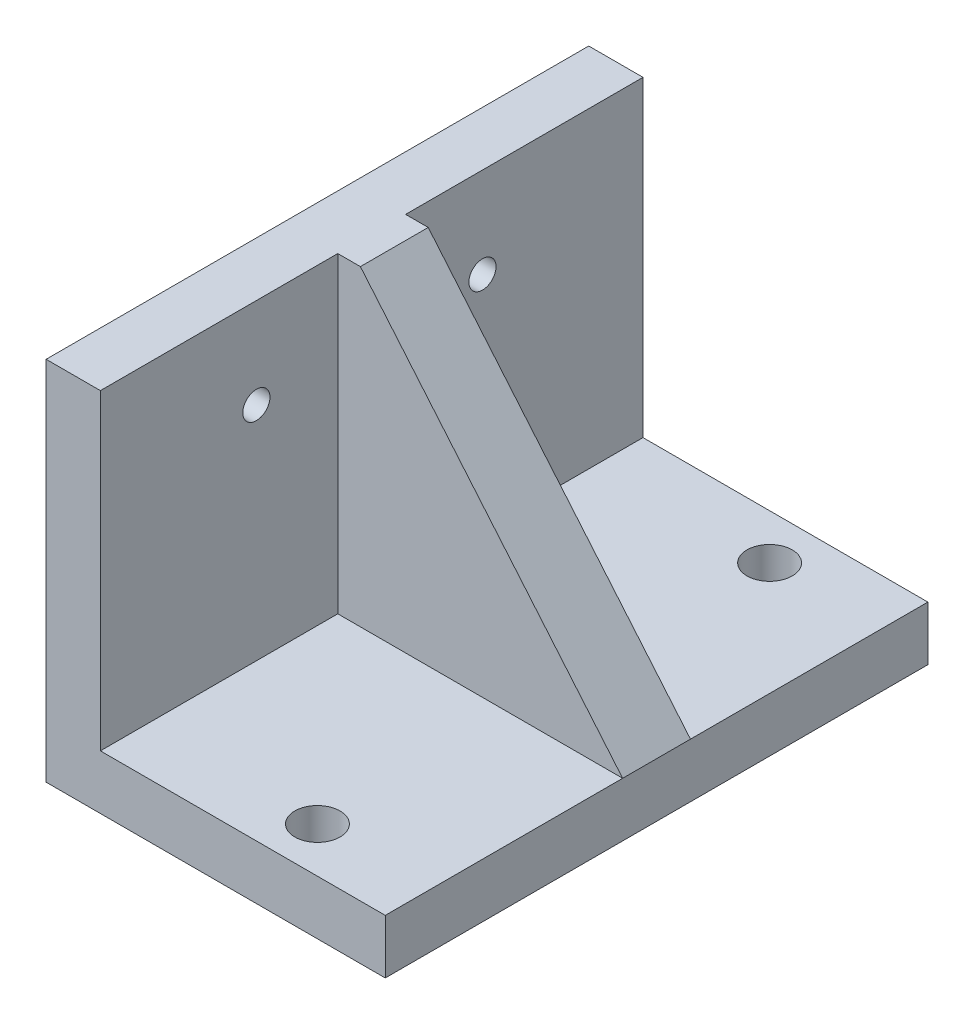
ISO-10303-21;
HEADER;
FILE_DESCRIPTION(('STEP AP214'),'2;1');
FILE_NAME('part.step','',(''),(''),'','','');
FILE_SCHEMA(('AUTOMOTIVE_DESIGN { 1 0 10303 214 1 1 1 1 }'));
ENDSEC;
DATA;
#1=APPLICATION_CONTEXT('core data for automotive mechanical design processes');
#2=APPLICATION_PROTOCOL_DEFINITION('international standard','automotive_design',2000,#1);
#3=PRODUCT_CONTEXT('',#1,'mechanical');
#4=PRODUCT('Part','Part','',(#3));
#5=PRODUCT_RELATED_PRODUCT_CATEGORY('part','',(#4));
#6=PRODUCT_DEFINITION_FORMATION('','',#4);
#7=PRODUCT_DEFINITION_CONTEXT('part definition',#1,'design');
#8=PRODUCT_DEFINITION('design','',#6,#7);
#9=PRODUCT_DEFINITION_SHAPE('','',#8);
#10=(LENGTH_UNIT() NAMED_UNIT(*) SI_UNIT(.MILLI.,.METRE.));
#11=(NAMED_UNIT(*) PLANE_ANGLE_UNIT() SI_UNIT($,.RADIAN.));
#12=(NAMED_UNIT(*) SI_UNIT($,.STERADIAN.) SOLID_ANGLE_UNIT());
#13=UNCERTAINTY_MEASURE_WITH_UNIT(LENGTH_MEASURE(1.E-05),#10,'distance_accuracy_value','');
#14=(GEOMETRIC_REPRESENTATION_CONTEXT(3) GLOBAL_UNCERTAINTY_ASSIGNED_CONTEXT((#13)) GLOBAL_UNIT_ASSIGNED_CONTEXT((#10,
#11,#12)) REPRESENTATION_CONTEXT('',''));
#15=CARTESIAN_POINT('',(0.,0.,0.));
#16=DIRECTION('',(0.,0.,1.));
#17=DIRECTION('',(1.,0.,0.));
#18=AXIS2_PLACEMENT_3D('',#15,#16,#17);
#19=CARTESIAN_POINT('',(12.,12.,120.));
#20=DIRECTION('',(0.,-1.,0.));
#21=DIRECTION('',(0.,0.,-1.));
#22=AXIS2_PLACEMENT_3D('',#19,#20,#21);
#23=PLANE('',#22);
#24=CARTESIAN_POINT('',(50.,12.,10.));
#25=DIRECTION('',(0.,1.,0.));
#26=DIRECTION('',(0.,0.,1.));
#27=AXIS2_PLACEMENT_3D('',#24,#25,#26);
#28=CIRCLE('',#27,5.);
#29=CARTESIAN_POINT('',(50.,12.,15.));
#30=VERTEX_POINT('',#29);
#31=EDGE_CURVE('E383',#30,#30,#28,.T.);
#32=ORIENTED_EDGE('',*,*,#31,.F.);
#33=EDGE_LOOP('',(#32));
#34=FACE_BOUND('',#33,.T.);
#35=DIRECTION('',(-1.,0.,0.));
#36=VECTOR('',#35,1.);
#37=CARTESIAN_POINT('',(12.,12.,52.5));
#38=LINE('',#37,#36);
#39=CARTESIAN_POINT('',(75.,12.,52.5));
#40=VERTEX_POINT('',#39);
#41=CARTESIAN_POINT('',(12.,12.,52.5));
#42=VERTEX_POINT('',#41);
#43=EDGE_CURVE('E123',#40,#42,#38,.T.);
#44=ORIENTED_EDGE('',*,*,#43,.F.);
#45=DIRECTION('',(0.,0.,-1.));
#46=VECTOR('',#45,1.);
#47=CARTESIAN_POINT('',(75.,12.,120.));
#48=LINE('',#47,#46);
#49=CARTESIAN_POINT('',(75.,12.,0.));
#50=VERTEX_POINT('',#49);
#51=EDGE_CURVE('E169',#40,#50,#48,.T.);
#52=ORIENTED_EDGE('',*,*,#51,.T.);
#53=DIRECTION('',(-1.,0.,0.));
#54=VECTOR('',#53,1.);
#55=CARTESIAN_POINT('',(12.,12.,0.));
#56=LINE('',#55,#54);
#57=CARTESIAN_POINT('',(12.,12.,0.));
#58=VERTEX_POINT('',#57);
#59=EDGE_CURVE('E140',#50,#58,#56,.T.);
#60=ORIENTED_EDGE('',*,*,#59,.T.);
#61=DIRECTION('',(0.,0.,-1.));
#62=VECTOR('',#61,1.);
#63=CARTESIAN_POINT('',(12.,12.,120.));
#64=LINE('',#63,#62);
#65=EDGE_CURVE('E165',#42,#58,#64,.T.);
#66=ORIENTED_EDGE('',*,*,#65,.F.);
#67=EDGE_LOOP('',(#44,#52,#60,#66));
#68=FACE_BOUND('',#67,.T.);
#69=ADVANCED_FACE('F16',(#34,#68),#23,.F.);
#70=CARTESIAN_POINT('',(12.,12.,120.));
#71=DIRECTION('',(-1.,0.,0.));
#72=DIRECTION('',(0.,-1.,0.));
#73=AXIS2_PLACEMENT_3D('',#70,#71,#72);
#74=PLANE('',#73);
#75=CARTESIAN_POINT('',(12.,61.,35.5));
#76=DIRECTION('',(1.,0.,0.));
#77=DIRECTION('',(0.,1.,0.));
#78=AXIS2_PLACEMENT_3D('',#75,#76,#77);
#79=CIRCLE('',#78,3.);
#80=CARTESIAN_POINT('',(12.,64.,35.5));
#81=VERTEX_POINT('',#80);
#82=EDGE_CURVE('E395',#81,#81,#79,.T.);
#83=ORIENTED_EDGE('',*,*,#82,.F.);
#84=EDGE_LOOP('',(#83));
#85=FACE_BOUND('',#84,.T.);
#86=DIRECTION('',(0.,1.,0.));
#87=VECTOR('',#86,1.);
#88=CARTESIAN_POINT('',(12.,12.,52.5));
#89=LINE('',#88,#87);
#90=CARTESIAN_POINT('',(12.,81.,52.5));
#91=VERTEX_POINT('',#90);
#92=EDGE_CURVE('E107',#42,#91,#89,.T.);
#93=ORIENTED_EDGE('',*,*,#92,.F.);
#94=ORIENTED_EDGE('',*,*,#65,.T.);
#95=DIRECTION('',(0.,1.,0.));
#96=VECTOR('',#95,1.);
#97=CARTESIAN_POINT('',(12.,12.,0.));
#98=LINE('',#97,#96);
#99=CARTESIAN_POINT('',(12.,81.,0.));
#100=VERTEX_POINT('',#99);
#101=EDGE_CURVE('E143',#58,#100,#98,.T.);
#102=ORIENTED_EDGE('',*,*,#101,.T.);
#103=DIRECTION('',(0.,0.,-1.));
#104=VECTOR('',#103,1.);
#105=CARTESIAN_POINT('',(12.,81.,120.));
#106=LINE('',#105,#104);
#107=EDGE_CURVE('E162',#91,#100,#106,.T.);
#108=ORIENTED_EDGE('',*,*,#107,.F.);
#109=EDGE_LOOP('',(#93,#94,#102,#108));
#110=FACE_BOUND('',#109,.T.);
#111=ADVANCED_FACE('F201',(#85,#110),#74,.F.);
#112=CARTESIAN_POINT('',(0.,0.,120.));
#113=DIRECTION('',(1.,0.,0.));
#114=DIRECTION('',(0.,1.,0.));
#115=AXIS2_PLACEMENT_3D('',#112,#113,#114);
#116=PLANE('',#115);
#117=DIRECTION('',(0.,0.,-1.));
#118=VECTOR('',#117,1.);
#119=CARTESIAN_POINT('',(0.,81.,120.));
#120=LINE('',#119,#118);
#121=CARTESIAN_POINT('',(0.,81.,120.));
#122=VERTEX_POINT('',#121);
#123=CARTESIAN_POINT('',(0.,81.,0.));
#124=VERTEX_POINT('',#123);
#125=EDGE_CURVE('E160',#122,#124,#120,.T.);
#126=ORIENTED_EDGE('',*,*,#125,.T.);
#127=DIRECTION('',(0.,-1.,0.));
#128=VECTOR('',#127,1.);
#129=CARTESIAN_POINT('',(0.,0.,0.));
#130=LINE('',#129,#128);
#131=CARTESIAN_POINT('',(0.,0.,0.));
#132=VERTEX_POINT('',#131);
#133=EDGE_CURVE('E131',#124,#132,#130,.T.);
#134=ORIENTED_EDGE('',*,*,#133,.T.);
#135=DIRECTION('',(0.,0.,-1.));
#136=VECTOR('',#135,1.);
#137=CARTESIAN_POINT('',(0.,0.,120.));
#138=LINE('',#137,#136);
#139=CARTESIAN_POINT('',(0.,0.,120.));
#140=VERTEX_POINT('',#139);
#141=EDGE_CURVE('E11',#140,#132,#138,.T.);
#142=ORIENTED_EDGE('',*,*,#141,.F.);
#143=DIRECTION('',(0.,-1.,0.));
#144=VECTOR('',#143,1.);
#145=CARTESIAN_POINT('',(0.,0.,120.));
#146=LINE('',#145,#144);
#147=EDGE_CURVE('E149',#122,#140,#146,.T.);
#148=ORIENTED_EDGE('',*,*,#147,.F.);
#149=EDGE_LOOP('',(#126,#134,#142,#148));
#150=FACE_BOUND('',#149,.T.);
#151=ADVANCED_FACE('F18',(#150),#116,.F.);
#152=CARTESIAN_POINT('',(12.,0.,120.));
#153=DIRECTION('',(0.,1.,0.));
#154=DIRECTION('',(0.,0.,1.));
#155=AXIS2_PLACEMENT_3D('',#152,#153,#154);
#156=PLANE('',#155);
#157=CARTESIAN_POINT('',(50.,0.,10.));
#158=DIRECTION('',(0.,1.,0.));
#159=DIRECTION('',(0.,0.,1.));
#160=AXIS2_PLACEMENT_3D('',#157,#158,#159);
#161=CIRCLE('',#160,5.);
#162=CARTESIAN_POINT('',(50.,0.,15.));
#163=VERTEX_POINT('',#162);
#164=EDGE_CURVE('E381',#163,#163,#161,.T.);
#165=ORIENTED_EDGE('',*,*,#164,.T.);
#166=EDGE_LOOP('',(#165));
#167=FACE_BOUND('',#166,.T.);
#168=CARTESIAN_POINT('',(50.,0.,110.));
#169=DIRECTION('',(0.,1.,0.));
#170=DIRECTION('',(0.,0.,1.));
#171=AXIS2_PLACEMENT_3D('',#168,#169,#170);
#172=CIRCLE('',#171,5.);
#173=CARTESIAN_POINT('',(50.,0.,115.));
#174=VERTEX_POINT('',#173);
#175=EDGE_CURVE('E113',#174,#174,#172,.T.);
#176=ORIENTED_EDGE('',*,*,#175,.T.);
#177=EDGE_LOOP('',(#176));
#178=FACE_BOUND('',#177,.T.);
#179=ORIENTED_EDGE('',*,*,#141,.T.);
#180=DIRECTION('',(1.,0.,0.));
#181=VECTOR('',#180,1.);
#182=CARTESIAN_POINT('',(12.,0.,0.));
#183=LINE('',#182,#181);
#184=CARTESIAN_POINT('',(75.,0.,0.));
#185=VERTEX_POINT('',#184);
#186=EDGE_CURVE('E134',#132,#185,#183,.T.);
#187=ORIENTED_EDGE('',*,*,#186,.T.);
#188=DIRECTION('',(0.,0.,-1.));
#189=VECTOR('',#188,1.);
#190=CARTESIAN_POINT('',(75.,0.,120.));
#191=LINE('',#190,#189);
#192=CARTESIAN_POINT('',(75.,0.,120.));
#193=VERTEX_POINT('',#192);
#194=EDGE_CURVE('E24',#193,#185,#191,.T.);
#195=ORIENTED_EDGE('',*,*,#194,.F.);
#196=DIRECTION('',(1.,0.,0.));
#197=VECTOR('',#196,1.);
#198=CARTESIAN_POINT('',(0.,0.,120.));
#199=LINE('',#198,#197);
#200=EDGE_CURVE('E151',#140,#193,#199,.T.);
#201=ORIENTED_EDGE('',*,*,#200,.F.);
#202=EDGE_LOOP('',(#179,#187,#195,#201));
#203=FACE_BOUND('',#202,.T.);
#204=ADVANCED_FACE('F182',(#167,#178,#203),#156,.F.);
#205=CARTESIAN_POINT('',(75.,0.,120.));
#206=DIRECTION('',(-1.,0.,0.));
#207=DIRECTION('',(0.,0.,1.));
#208=AXIS2_PLACEMENT_3D('',#205,#206,#207);
#209=PLANE('',#208);
#210=ORIENTED_EDGE('',*,*,#194,.T.);
#211=DIRECTION('',(0.,1.,0.));
#212=VECTOR('',#211,1.);
#213=CARTESIAN_POINT('',(75.,0.,0.));
#214=LINE('',#213,#212);
#215=EDGE_CURVE('E137',#185,#50,#214,.T.);
#216=ORIENTED_EDGE('',*,*,#215,.T.);
#217=ORIENTED_EDGE('',*,*,#51,.F.);
#218=CARTESIAN_POINT('',(75.,12.,67.5));
#219=VERTEX_POINT('',#218);
#220=EDGE_CURVE('E100',#219,#40,#48,.T.);
#221=ORIENTED_EDGE('',*,*,#220,.F.);
#222=CARTESIAN_POINT('',(75.,12.,120.));
#223=VERTEX_POINT('',#222);
#224=EDGE_CURVE('E170',#223,#219,#48,.T.);
#225=ORIENTED_EDGE('',*,*,#224,.F.);
#226=DIRECTION('',(0.,1.,0.));
#227=VECTOR('',#226,1.);
#228=CARTESIAN_POINT('',(75.,0.,120.));
#229=LINE('',#228,#227);
#230=EDGE_CURVE('E153',#193,#223,#229,.T.);
#231=ORIENTED_EDGE('',*,*,#230,.F.);
#232=EDGE_LOOP('',(#210,#216,#217,#221,#225,#231));
#233=FACE_BOUND('',#232,.T.);
#234=ADVANCED_FACE('F175',(#233),#209,.F.);
#235=CARTESIAN_POINT('',(50.,12.,110.));
#236=DIRECTION('',(0.,1.,0.));
#237=DIRECTION('',(0.,0.,1.));
#238=AXIS2_PLACEMENT_3D('',#235,#236,#237);
#239=CIRCLE('',#238,5.);
#240=CARTESIAN_POINT('',(50.,12.,115.));
#241=VERTEX_POINT('',#240);
#242=EDGE_CURVE('E116',#241,#241,#239,.T.);
#243=ORIENTED_EDGE('',*,*,#242,.F.);
#244=EDGE_LOOP('',(#243));
#245=FACE_BOUND('',#244,.T.);
#246=ORIENTED_EDGE('',*,*,#224,.T.);
#247=DIRECTION('',(-1.,0.,0.));
#248=VECTOR('',#247,1.);
#249=CARTESIAN_POINT('',(12.,12.,67.5));
#250=LINE('',#249,#248);
#251=CARTESIAN_POINT('',(12.,12.,67.5));
#252=VERTEX_POINT('',#251);
#253=EDGE_CURVE('E128',#219,#252,#250,.T.);
#254=ORIENTED_EDGE('',*,*,#253,.T.);
#255=CARTESIAN_POINT('',(12.,12.,120.));
#256=VERTEX_POINT('',#255);
#257=EDGE_CURVE('E166',#256,#252,#64,.T.);
#258=ORIENTED_EDGE('',*,*,#257,.F.);
#259=DIRECTION('',(-1.,0.,0.));
#260=VECTOR('',#259,1.);
#261=CARTESIAN_POINT('',(12.,12.,120.));
#262=LINE('',#261,#260);
#263=EDGE_CURVE('E155',#223,#256,#262,.T.);
#264=ORIENTED_EDGE('',*,*,#263,.F.);
#265=EDGE_LOOP('',(#246,#254,#258,#264));
#266=FACE_BOUND('',#265,.T.);
#267=ADVANCED_FACE('F193',(#245,#266),#23,.F.);
#268=CARTESIAN_POINT('',(12.,61.,85.5));
#269=DIRECTION('',(1.,0.,0.));
#270=DIRECTION('',(0.,1.,0.));
#271=AXIS2_PLACEMENT_3D('',#268,#269,#270);
#272=CIRCLE('',#271,3.);
#273=CARTESIAN_POINT('',(12.,64.,85.5));
#274=VERTEX_POINT('',#273);
#275=EDGE_CURVE('E225',#274,#274,#272,.T.);
#276=ORIENTED_EDGE('',*,*,#275,.F.);
#277=EDGE_LOOP('',(#276));
#278=FACE_BOUND('',#277,.T.);
#279=ORIENTED_EDGE('',*,*,#257,.T.);
#280=DIRECTION('',(0.,1.,0.));
#281=VECTOR('',#280,1.);
#282=CARTESIAN_POINT('',(12.,12.,67.5));
#283=LINE('',#282,#281);
#284=CARTESIAN_POINT('',(12.,81.,67.5));
#285=VERTEX_POINT('',#284);
#286=EDGE_CURVE('E125',#252,#285,#283,.T.);
#287=ORIENTED_EDGE('',*,*,#286,.T.);
#288=CARTESIAN_POINT('',(12.,81.,120.));
#289=VERTEX_POINT('',#288);
#290=EDGE_CURVE('E163',#289,#285,#106,.T.);
#291=ORIENTED_EDGE('',*,*,#290,.F.);
#292=DIRECTION('',(0.,1.,0.));
#293=VECTOR('',#292,1.);
#294=CARTESIAN_POINT('',(12.,12.,120.));
#295=LINE('',#294,#293);
#296=EDGE_CURVE('E157',#256,#289,#295,.T.);
#297=ORIENTED_EDGE('',*,*,#296,.F.);
#298=EDGE_LOOP('',(#279,#287,#291,#297));
#299=FACE_BOUND('',#298,.T.);
#300=ADVANCED_FACE('F205',(#278,#299),#74,.F.);
#301=CARTESIAN_POINT('',(0.,81.,120.));
#302=DIRECTION('',(0.,-1.,0.));
#303=DIRECTION('',(0.,0.,-1.));
#304=AXIS2_PLACEMENT_3D('',#301,#302,#303);
#305=PLANE('',#304);
#306=ORIENTED_EDGE('',*,*,#290,.T.);
#307=DIRECTION('',(1.,0.,0.));
#308=VECTOR('',#307,1.);
#309=CARTESIAN_POINT('',(37.5,81.,67.5));
#310=LINE('',#309,#308);
#311=CARTESIAN_POINT('',(17.,81.,67.5));
#312=VERTEX_POINT('',#311);
#313=EDGE_CURVE('E103',#312,#285,#310,.F.);
#314=ORIENTED_EDGE('',*,*,#313,.F.);
#315=DIRECTION('',(0.,0.,1.));
#316=VECTOR('',#315,1.);
#317=CARTESIAN_POINT('',(17.,81.,60.));
#318=LINE('',#317,#316);
#319=CARTESIAN_POINT('',(17.,81.,52.5));
#320=VERTEX_POINT('',#319);
#321=EDGE_CURVE('E97',#320,#312,#318,.T.);
#322=ORIENTED_EDGE('',*,*,#321,.F.);
#323=DIRECTION('',(1.,0.,0.));
#324=VECTOR('',#323,1.);
#325=CARTESIAN_POINT('',(37.5,81.,52.5));
#326=LINE('',#325,#324);
#327=EDGE_CURVE('E31',#320,#91,#326,.F.);
#328=ORIENTED_EDGE('',*,*,#327,.T.);
#329=ORIENTED_EDGE('',*,*,#107,.T.);
#330=DIRECTION('',(-1.,0.,0.));
#331=VECTOR('',#330,1.);
#332=CARTESIAN_POINT('',(0.,81.,0.));
#333=LINE('',#332,#331);
#334=EDGE_CURVE('E146',#100,#124,#333,.T.);
#335=ORIENTED_EDGE('',*,*,#334,.T.);
#336=ORIENTED_EDGE('',*,*,#125,.F.);
#337=DIRECTION('',(-1.,0.,0.));
#338=VECTOR('',#337,1.);
#339=CARTESIAN_POINT('',(0.,81.,120.));
#340=LINE('',#339,#338);
#341=EDGE_CURVE('E39',#289,#122,#340,.T.);
#342=ORIENTED_EDGE('',*,*,#341,.F.);
#343=EDGE_LOOP('',(#306,#314,#322,#328,#329,#335,#336,#342));
#344=FACE_BOUND('',#343,.T.);
#345=ADVANCED_FACE('F106',(#344),#305,.F.);
#346=CARTESIAN_POINT('',(0.,81.,120.));
#347=DIRECTION('',(0.,0.,-1.));
#348=DIRECTION('',(-1.,0.,0.));
#349=AXIS2_PLACEMENT_3D('',#346,#347,#348);
#350=PLANE('',#349);
#351=ORIENTED_EDGE('',*,*,#147,.T.);
#352=ORIENTED_EDGE('',*,*,#200,.T.);
#353=ORIENTED_EDGE('',*,*,#230,.T.);
#354=ORIENTED_EDGE('',*,*,#263,.T.);
#355=ORIENTED_EDGE('',*,*,#296,.T.);
#356=ORIENTED_EDGE('',*,*,#341,.T.);
#357=EDGE_LOOP('',(#351,#352,#353,#354,#355,#356));
#358=FACE_BOUND('',#357,.T.);
#359=ADVANCED_FACE('F196',(#358),#350,.F.);
#360=CARTESIAN_POINT('',(0.,81.,0.));
#361=DIRECTION('',(0.,0.,-1.));
#362=DIRECTION('',(-1.,0.,0.));
#363=AXIS2_PLACEMENT_3D('',#360,#361,#362);
#364=PLANE('',#363);
#365=ORIENTED_EDGE('',*,*,#133,.F.);
#366=ORIENTED_EDGE('',*,*,#334,.F.);
#367=ORIENTED_EDGE('',*,*,#101,.F.);
#368=ORIENTED_EDGE('',*,*,#59,.F.);
#369=ORIENTED_EDGE('',*,*,#215,.F.);
#370=ORIENTED_EDGE('',*,*,#186,.F.);
#371=EDGE_LOOP('',(#365,#366,#367,#368,#369,#370));
#372=FACE_BOUND('',#371,.T.);
#373=ADVANCED_FACE('F186',(#372),#364,.T.);
#374=CARTESIAN_POINT('',(75.,12.,60.));
#375=DIRECTION('',(0.765486270790816,0.643452227621266,0.));
#376=DIRECTION('',(-0.643452227621266,0.765486270790816,0.));
#377=AXIS2_PLACEMENT_3D('',#374,#375,#376);
#378=PLANE('',#377);
#379=ORIENTED_EDGE('',*,*,#220,.T.);
#380=DIRECTION('',(-0.643452227621266,0.765486270790816,0.));
#381=VECTOR('',#380,1.);
#382=CARTESIAN_POINT('',(75.,12.,52.5));
#383=LINE('',#382,#381);
#384=EDGE_CURVE('E94',#40,#320,#383,.T.);
#385=ORIENTED_EDGE('',*,*,#384,.T.);
#386=ORIENTED_EDGE('',*,*,#321,.T.);
#387=DIRECTION('',(-0.643452227621266,0.765486270790816,0.));
#388=VECTOR('',#387,1.);
#389=CARTESIAN_POINT('',(75.,12.,67.5));
#390=LINE('',#389,#388);
#391=EDGE_CURVE('E108',#219,#312,#390,.T.);
#392=ORIENTED_EDGE('',*,*,#391,.F.);
#393=EDGE_LOOP('',(#379,#385,#386,#392));
#394=FACE_BOUND('',#393,.T.);
#395=ADVANCED_FACE('F95',(#394),#378,.T.);
#396=CARTESIAN_POINT('',(37.5,40.5,67.5));
#397=DIRECTION('',(0.,0.,1.));
#398=DIRECTION('',(1.,0.,0.));
#399=AXIS2_PLACEMENT_3D('',#396,#397,#398);
#400=PLANE('',#399);
#401=ORIENTED_EDGE('',*,*,#253,.F.);
#402=ORIENTED_EDGE('',*,*,#391,.T.);
#403=ORIENTED_EDGE('',*,*,#313,.T.);
#404=ORIENTED_EDGE('',*,*,#286,.F.);
#405=EDGE_LOOP('',(#401,#402,#403,#404));
#406=FACE_BOUND('',#405,.T.);
#407=ADVANCED_FACE('F227',(#406),#400,.T.);
#408=CARTESIAN_POINT('',(37.5,40.5,52.5));
#409=DIRECTION('',(0.,0.,1.));
#410=DIRECTION('',(1.,0.,0.));
#411=AXIS2_PLACEMENT_3D('',#408,#409,#410);
#412=PLANE('',#411);
#413=ORIENTED_EDGE('',*,*,#384,.F.);
#414=ORIENTED_EDGE('',*,*,#43,.T.);
#415=ORIENTED_EDGE('',*,*,#92,.T.);
#416=ORIENTED_EDGE('',*,*,#327,.F.);
#417=EDGE_LOOP('',(#413,#414,#415,#416));
#418=FACE_BOUND('',#417,.T.);
#419=ADVANCED_FACE('F110',(#418),#412,.F.);
#420=CARTESIAN_POINT('',(50.,0.,110.));
#421=DIRECTION('',(0.,1.,0.));
#422=DIRECTION('',(0.,0.,1.));
#423=AXIS2_PLACEMENT_3D('',#420,#421,#422);
#424=CYLINDRICAL_SURFACE('',#423,5.);
#425=ORIENTED_EDGE('',*,*,#175,.F.);
#426=EDGE_LOOP('',(#425));
#427=FACE_BOUND('',#426,.T.);
#428=ORIENTED_EDGE('',*,*,#242,.T.);
#429=EDGE_LOOP('',(#428));
#430=FACE_BOUND('',#429,.T.);
#431=ADVANCED_FACE('F234',(#427,#430),#424,.F.);
#432=CARTESIAN_POINT('',(50.,0.,10.));
#433=DIRECTION('',(0.,1.,0.));
#434=DIRECTION('',(0.,0.,1.));
#435=AXIS2_PLACEMENT_3D('',#432,#433,#434);
#436=CYLINDRICAL_SURFACE('',#435,5.);
#437=ORIENTED_EDGE('',*,*,#164,.F.);
#438=EDGE_LOOP('',(#437));
#439=FACE_BOUND('',#438,.T.);
#440=ORIENTED_EDGE('',*,*,#31,.T.);
#441=EDGE_LOOP('',(#440));
#442=FACE_BOUND('',#441,.T.);
#443=ADVANCED_FACE('F356',(#439,#442),#436,.F.);
#444=CARTESIAN_POINT('',(2.,61.,85.5));
#445=DIRECTION('',(1.,0.,0.));
#446=DIRECTION('',(0.,1.,0.));
#447=AXIS2_PLACEMENT_3D('',#444,#445,#446);
#448=CYLINDRICAL_SURFACE('',#447,3.);
#449=CARTESIAN_POINT('',(2.,61.,85.5));
#450=DIRECTION('',(1.,0.,0.));
#451=DIRECTION('',(0.,1.,0.));
#452=AXIS2_PLACEMENT_3D('',#449,#450,#451);
#453=CIRCLE('',#452,3.);
#454=CARTESIAN_POINT('',(2.,64.,85.5));
#455=VERTEX_POINT('',#454);
#456=EDGE_CURVE('E388',#455,#455,#453,.T.);
#457=ORIENTED_EDGE('',*,*,#456,.F.);
#458=EDGE_LOOP('',(#457));
#459=FACE_BOUND('',#458,.T.);
#460=ORIENTED_EDGE('',*,*,#275,.T.);
#461=EDGE_LOOP('',(#460));
#462=FACE_BOUND('',#461,.T.);
#463=ADVANCED_FACE('F346',(#459,#462),#448,.F.);
#464=CARTESIAN_POINT('',(2.,61.,85.5));
#465=DIRECTION('',(1.,0.,0.));
#466=DIRECTION('',(0.,1.,0.));
#467=AXIS2_PLACEMENT_3D('',#464,#465,#466);
#468=PLANE('',#467);
#469=ORIENTED_EDGE('',*,*,#456,.T.);
#470=EDGE_LOOP('',(#469));
#471=FACE_BOUND('',#470,.T.);
#472=ADVANCED_FACE('F336',(#471),#468,.T.);
#473=CARTESIAN_POINT('',(2.,61.,35.5));
#474=DIRECTION('',(1.,0.,0.));
#475=DIRECTION('',(0.,1.,0.));
#476=AXIS2_PLACEMENT_3D('',#473,#474,#475);
#477=CYLINDRICAL_SURFACE('',#476,3.);
#478=CARTESIAN_POINT('',(2.,61.,35.5));
#479=DIRECTION('',(1.,0.,0.));
#480=DIRECTION('',(0.,1.,0.));
#481=AXIS2_PLACEMENT_3D('',#478,#479,#480);
#482=CIRCLE('',#481,3.);
#483=CARTESIAN_POINT('',(2.,64.,35.5));
#484=VERTEX_POINT('',#483);
#485=EDGE_CURVE('E392',#484,#484,#482,.T.);
#486=ORIENTED_EDGE('',*,*,#485,.F.);
#487=EDGE_LOOP('',(#486));
#488=FACE_BOUND('',#487,.T.);
#489=ORIENTED_EDGE('',*,*,#82,.T.);
#490=EDGE_LOOP('',(#489));
#491=FACE_BOUND('',#490,.T.);
#492=ADVANCED_FACE('F326',(#488,#491),#477,.F.);
#493=CARTESIAN_POINT('',(2.,61.,35.5));
#494=DIRECTION('',(1.,0.,0.));
#495=DIRECTION('',(0.,1.,0.));
#496=AXIS2_PLACEMENT_3D('',#493,#494,#495);
#497=PLANE('',#496);
#498=ORIENTED_EDGE('',*,*,#485,.T.);
#499=EDGE_LOOP('',(#498));
#500=FACE_BOUND('',#499,.T.);
#501=ADVANCED_FACE('F322',(#500),#497,.T.);
#502=CLOSED_SHELL('',(#69,#111,#151,#204,#234,#267,#300,#345,#359,#373,#395,#407,#419,#431,#443,
#463,#472,#492,#501));
#503=MANIFOLD_SOLID_BREP('B1',#502);
#504=ADVANCED_BREP_SHAPE_REPRESENTATION('',(#18,#503),#14);
#505=SHAPE_DEFINITION_REPRESENTATION(#9,#504);
ENDSEC;
END-ISO-10303-21;
